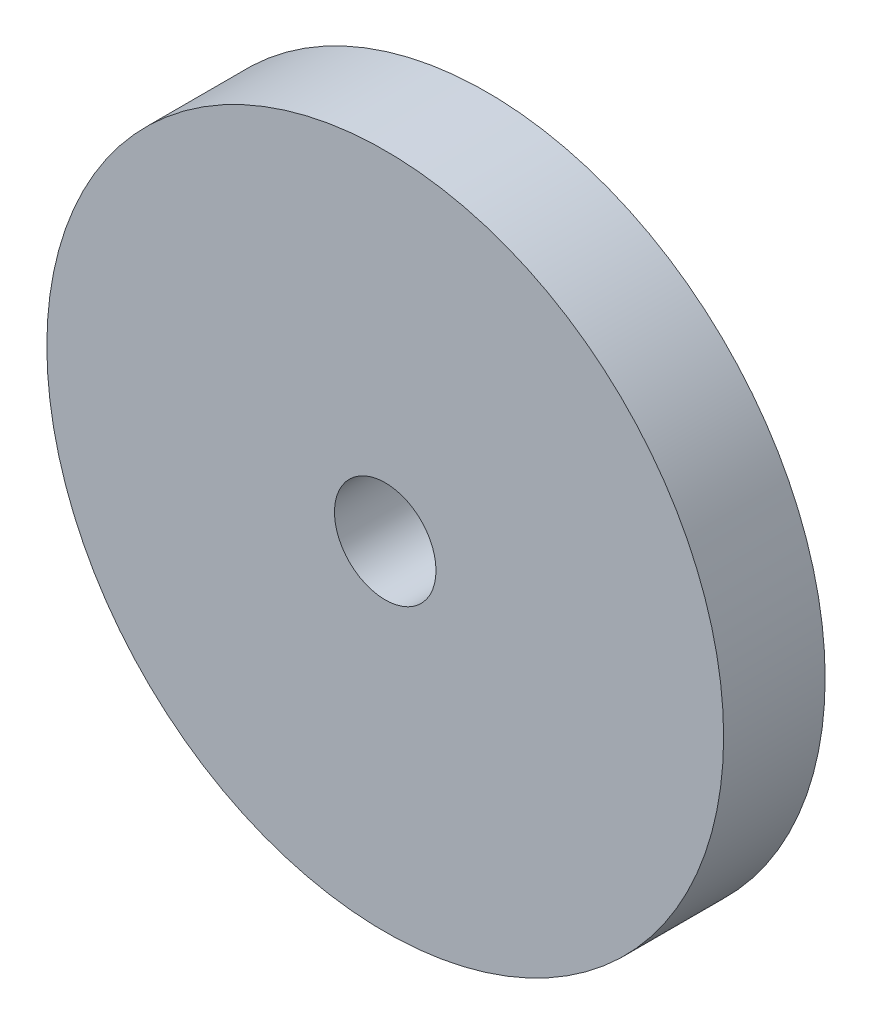
ISO-10303-21;
HEADER;
FILE_DESCRIPTION(('STEP AP214'),'2;1');
FILE_NAME('part.step','',(''),(''),'','','');
FILE_SCHEMA(('AUTOMOTIVE_DESIGN { 1 0 10303 214 1 1 1 1 }'));
ENDSEC;
DATA;
#1=APPLICATION_CONTEXT('core data for automotive mechanical design processes');
#2=APPLICATION_PROTOCOL_DEFINITION('international standard','automotive_design',2000,#1);
#3=PRODUCT_CONTEXT('',#1,'mechanical');
#4=PRODUCT('Part','Part','',(#3));
#5=PRODUCT_RELATED_PRODUCT_CATEGORY('part','',(#4));
#6=PRODUCT_DEFINITION_FORMATION('','',#4);
#7=PRODUCT_DEFINITION_CONTEXT('part definition',#1,'design');
#8=PRODUCT_DEFINITION('design','',#6,#7);
#9=PRODUCT_DEFINITION_SHAPE('','',#8);
#10=(LENGTH_UNIT() NAMED_UNIT(*) SI_UNIT(.MILLI.,.METRE.));
#11=(NAMED_UNIT(*) PLANE_ANGLE_UNIT() SI_UNIT($,.RADIAN.));
#12=(NAMED_UNIT(*) SI_UNIT($,.STERADIAN.) SOLID_ANGLE_UNIT());
#13=UNCERTAINTY_MEASURE_WITH_UNIT(LENGTH_MEASURE(1.E-05),#10,'distance_accuracy_value','');
#14=(GEOMETRIC_REPRESENTATION_CONTEXT(3) GLOBAL_UNCERTAINTY_ASSIGNED_CONTEXT((#13)) GLOBAL_UNIT_ASSIGNED_CONTEXT((#10,
#11,#12)) REPRESENTATION_CONTEXT('',''));
#15=CARTESIAN_POINT('',(0.,0.,0.));
#16=DIRECTION('',(0.,0.,1.));
#17=DIRECTION('',(1.,0.,0.));
#18=AXIS2_PLACEMENT_3D('',#15,#16,#17);
#19=CARTESIAN_POINT('',(-25.0000000000022,-9.99999999999914,-15.));
#20=DIRECTION('',(0.,0.,1.));
#21=DIRECTION('',(1.,0.,0.));
#22=AXIS2_PLACEMENT_3D('',#19,#20,#21);
#23=CYLINDRICAL_SURFACE('',#22,50.);
#24=CARTESIAN_POINT('',(-25.0000000000022,-9.99999999999914,-15.));
#25=DIRECTION('',(0.,0.,1.));
#26=DIRECTION('',(1.,0.,0.));
#27=AXIS2_PLACEMENT_3D('',#24,#25,#26);
#28=CIRCLE('',#27,50.);
#29=CARTESIAN_POINT('',(24.9999999999978,-9.99999999999914,-15.));
#30=VERTEX_POINT('',#29);
#31=EDGE_CURVE('E10',#30,#30,#28,.T.);
#32=ORIENTED_EDGE('',*,*,#31,.T.);
#33=EDGE_LOOP('',(#32));
#34=FACE_BOUND('',#33,.T.);
#35=CARTESIAN_POINT('',(-25.0000000000022,-9.99999999999914,0.));
#36=DIRECTION('',(0.,0.,1.));
#37=DIRECTION('',(1.,0.,0.));
#38=AXIS2_PLACEMENT_3D('',#35,#36,#37);
#39=CIRCLE('',#38,50.);
#40=CARTESIAN_POINT('',(24.9999999999978,-9.99999999999914,0.));
#41=VERTEX_POINT('',#40);
#42=EDGE_CURVE('E37',#41,#41,#39,.T.);
#43=ORIENTED_EDGE('',*,*,#42,.F.);
#44=EDGE_LOOP('',(#43));
#45=FACE_BOUND('',#44,.T.);
#46=ADVANCED_FACE('F34',(#34,#45),#23,.T.);
#47=CARTESIAN_POINT('',(-25.0000000000022,-9.99999999999914,-15.));
#48=DIRECTION('',(0.,0.,1.));
#49=DIRECTION('',(1.,0.,0.));
#50=AXIS2_PLACEMENT_3D('',#47,#48,#49);
#51=PLANE('',#50);
#52=CARTESIAN_POINT('',(-25.0000000000022,-9.99999999999914,-15.));
#53=DIRECTION('',(0.,0.,1.));
#54=DIRECTION('',(1.,0.,0.));
#55=AXIS2_PLACEMENT_3D('',#52,#53,#54);
#56=CIRCLE('',#55,7.5);
#57=CARTESIAN_POINT('',(-17.5000000000022,-9.99999999999914,-15.));
#58=VERTEX_POINT('',#57);
#59=EDGE_CURVE('E44',#58,#58,#56,.T.);
#60=ORIENTED_EDGE('',*,*,#59,.T.);
#61=EDGE_LOOP('',(#60));
#62=FACE_BOUND('',#61,.T.);
#63=ORIENTED_EDGE('',*,*,#31,.F.);
#64=EDGE_LOOP('',(#63));
#65=FACE_BOUND('',#64,.T.);
#66=ADVANCED_FACE('F52',(#62,#65),#51,.F.);
#67=CARTESIAN_POINT('',(-25.0000000000022,-9.99999999999914,0.));
#68=DIRECTION('',(0.,0.,1.));
#69=DIRECTION('',(1.,0.,0.));
#70=AXIS2_PLACEMENT_3D('',#67,#68,#69);
#71=PLANE('',#70);
#72=CARTESIAN_POINT('',(-25.0000000000022,-9.99999999999914,0.));
#73=DIRECTION('',(0.,0.,1.));
#74=DIRECTION('',(1.,0.,0.));
#75=AXIS2_PLACEMENT_3D('',#72,#73,#74);
#76=CIRCLE('',#75,7.5);
#77=CARTESIAN_POINT('',(-17.5000000000022,-9.99999999999914,0.));
#78=VERTEX_POINT('',#77);
#79=EDGE_CURVE('E46',#78,#78,#76,.T.);
#80=ORIENTED_EDGE('',*,*,#79,.F.);
#81=EDGE_LOOP('',(#80));
#82=FACE_BOUND('',#81,.T.);
#83=ORIENTED_EDGE('',*,*,#42,.T.);
#84=EDGE_LOOP('',(#83));
#85=FACE_BOUND('',#84,.T.);
#86=ADVANCED_FACE('F58',(#82,#85),#71,.T.);
#87=CARTESIAN_POINT('',(-25.0000000000022,-9.99999999999914,-15.));
#88=DIRECTION('',(0.,0.,1.));
#89=DIRECTION('',(1.,0.,0.));
#90=AXIS2_PLACEMENT_3D('',#87,#88,#89);
#91=CYLINDRICAL_SURFACE('',#90,7.5);
#92=ORIENTED_EDGE('',*,*,#59,.F.);
#93=EDGE_LOOP('',(#92));
#94=FACE_BOUND('',#93,.T.);
#95=ORIENTED_EDGE('',*,*,#79,.T.);
#96=EDGE_LOOP('',(#95));
#97=FACE_BOUND('',#96,.T.);
#98=ADVANCED_FACE('F55',(#94,#97),#91,.F.);
#99=CLOSED_SHELL('',(#46,#66,#86,#98));
#100=MANIFOLD_SOLID_BREP('B2',#99);
#101=ADVANCED_BREP_SHAPE_REPRESENTATION('',(#18,#100),#14);
#102=SHAPE_DEFINITION_REPRESENTATION(#9,#101);
ENDSEC;
END-ISO-10303-21;
